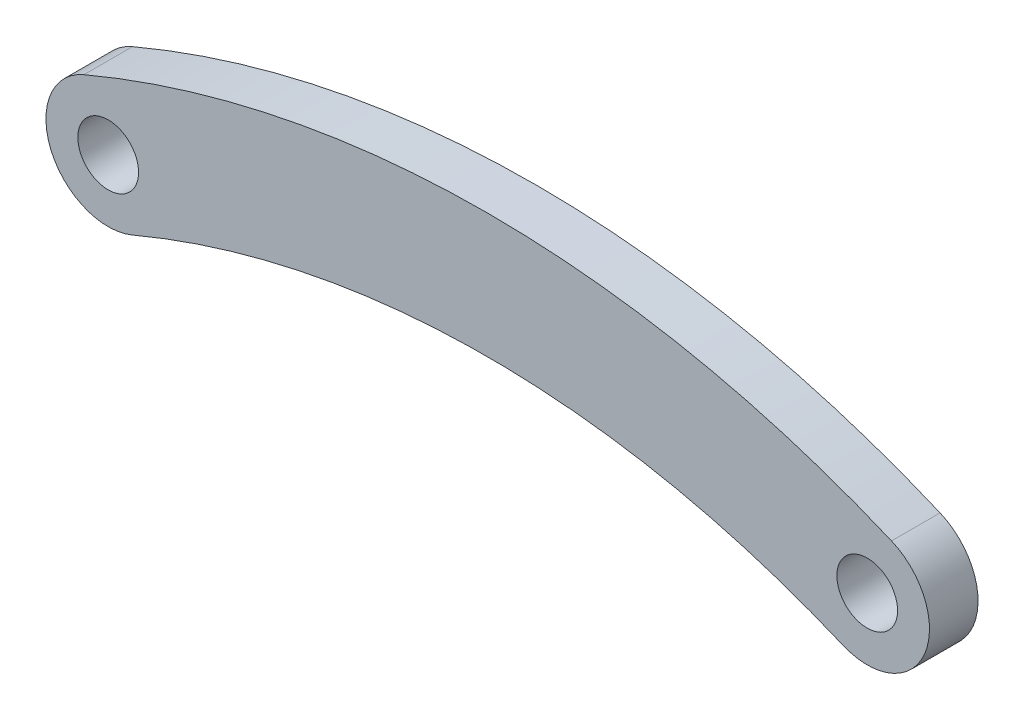
ISO-10303-21;
HEADER;
FILE_DESCRIPTION(('STEP AP214'),'2;1');
FILE_NAME('part.step','',(''),(''),'','','');
FILE_SCHEMA(('AUTOMOTIVE_DESIGN { 1 0 10303 214 1 1 1 1 }'));
ENDSEC;
DATA;
#1=APPLICATION_CONTEXT('core data for automotive mechanical design processes');
#2=APPLICATION_PROTOCOL_DEFINITION('international standard','automotive_design',2000,#1);
#3=PRODUCT_CONTEXT('',#1,'mechanical');
#4=PRODUCT('Part','Part','',(#3));
#5=PRODUCT_RELATED_PRODUCT_CATEGORY('part','',(#4));
#6=PRODUCT_DEFINITION_FORMATION('','',#4);
#7=PRODUCT_DEFINITION_CONTEXT('part definition',#1,'design');
#8=PRODUCT_DEFINITION('design','',#6,#7);
#9=PRODUCT_DEFINITION_SHAPE('','',#8);
#10=(LENGTH_UNIT() NAMED_UNIT(*) SI_UNIT(.MILLI.,.METRE.));
#11=(NAMED_UNIT(*) PLANE_ANGLE_UNIT() SI_UNIT($,.RADIAN.));
#12=(NAMED_UNIT(*) SI_UNIT($,.STERADIAN.) SOLID_ANGLE_UNIT());
#13=UNCERTAINTY_MEASURE_WITH_UNIT(LENGTH_MEASURE(1.E-05),#10,'distance_accuracy_value','');
#14=(GEOMETRIC_REPRESENTATION_CONTEXT(3) GLOBAL_UNCERTAINTY_ASSIGNED_CONTEXT((#13)) GLOBAL_UNIT_ASSIGNED_CONTEXT((#10,
#11,#12)) REPRESENTATION_CONTEXT('',''));
#15=CARTESIAN_POINT('',(0.,0.,0.));
#16=DIRECTION('',(0.,0.,1.));
#17=DIRECTION('',(1.,0.,0.));
#18=AXIS2_PLACEMENT_3D('',#15,#16,#17);
#19=CARTESIAN_POINT('',(18.75,-14.7559521888626,1.6));
#20=DIRECTION('',(0.,0.,1.));
#21=DIRECTION('',(1.,0.,0.));
#22=AXIS2_PLACEMENT_3D('',#19,#20,#21);
#23=PLANE('',#22);
#24=CARTESIAN_POINT('',(0.,0.,1.6));
#25=DIRECTION('',(0.,0.,1.));
#26=DIRECTION('',(1.,0.,0.));
#27=AXIS2_PLACEMENT_3D('',#24,#25,#26);
#28=CIRCLE('',#27,1.);
#29=CARTESIAN_POINT('',(1.,0.,1.6));
#30=VERTEX_POINT('',#29);
#31=EDGE_CURVE('E99',#30,#30,#28,.T.);
#32=ORIENTED_EDGE('',*,*,#31,.F.);
#33=EDGE_LOOP('',(#32));
#34=FACE_BOUND('',#33,.T.);
#35=CARTESIAN_POINT('',(25.,0.,1.6));
#36=DIRECTION('',(0.,0.,1.));
#37=DIRECTION('',(1.,0.,0.));
#38=AXIS2_PLACEMENT_3D('',#35,#36,#37);
#39=CIRCLE('',#38,2.04999999999999);
#40=CARTESIAN_POINT('',(24.2004680187207,-1.88765691027571,1.6));
#41=VERTEX_POINT('',#40);
#42=CARTESIAN_POINT('',(25.7995319812792,1.88765691027572,1.6));
#43=VERTEX_POINT('',#42);
#44=EDGE_CURVE('E84',#41,#43,#39,.T.);
#45=ORIENTED_EDGE('',*,*,#44,.T.);
#46=CARTESIAN_POINT('',(12.5,-29.5119043777253,1.6));
#47=DIRECTION('',(0.,0.,1.));
#48=DIRECTION('',(1.,0.,0.));
#49=AXIS2_PLACEMENT_3D('',#46,#47,#48);
#50=CIRCLE('',#49,34.1);
#51=CARTESIAN_POINT('',(-0.799531981279251,1.88765691027571,1.6));
#52=VERTEX_POINT('',#51);
#53=EDGE_CURVE('E79',#43,#52,#50,.T.);
#54=ORIENTED_EDGE('',*,*,#53,.T.);
#55=CARTESIAN_POINT('',(0.,0.,1.6));
#56=DIRECTION('',(0.,0.,1.));
#57=DIRECTION('',(1.,0.,0.));
#58=AXIS2_PLACEMENT_3D('',#55,#56,#57);
#59=CIRCLE('',#58,2.04999999999999);
#60=CARTESIAN_POINT('',(0.799531981279247,-1.88765691027571,1.6));
#61=VERTEX_POINT('',#60);
#62=EDGE_CURVE('E82',#52,#61,#59,.T.);
#63=ORIENTED_EDGE('',*,*,#62,.T.);
#64=CARTESIAN_POINT('',(12.5,-29.5119043777253,1.6));
#65=DIRECTION('',(0.,0.,-1.));
#66=DIRECTION('',(1.,0.,0.));
#67=AXIS2_PLACEMENT_3D('',#64,#65,#66);
#68=CIRCLE('',#67,30.);
#69=EDGE_CURVE('E49',#61,#41,#68,.T.);
#70=ORIENTED_EDGE('',*,*,#69,.T.);
#71=EDGE_LOOP('',(#45,#54,#63,#70));
#72=FACE_BOUND('',#71,.T.);
#73=CARTESIAN_POINT('',(25.,0.,1.6));
#74=DIRECTION('',(0.,0.,1.));
#75=DIRECTION('',(1.,0.,0.));
#76=AXIS2_PLACEMENT_3D('',#73,#74,#75);
#77=CIRCLE('',#76,1.);
#78=CARTESIAN_POINT('',(26.,0.,1.6));
#79=VERTEX_POINT('',#78);
#80=EDGE_CURVE('E114',#79,#79,#77,.T.);
#81=ORIENTED_EDGE('',*,*,#80,.F.);
#82=EDGE_LOOP('',(#81));
#83=FACE_BOUND('',#82,.T.);
#84=ADVANCED_FACE('F32',(#34,#72,#83),#23,.T.);
#85=CARTESIAN_POINT('',(18.75,-14.7559521888626,0.));
#86=DIRECTION('',(0.,0.,1.));
#87=DIRECTION('',(1.,0.,0.));
#88=AXIS2_PLACEMENT_3D('',#85,#86,#87);
#89=PLANE('',#88);
#90=CARTESIAN_POINT('',(25.,0.,0.));
#91=DIRECTION('',(0.,0.,1.));
#92=DIRECTION('',(1.,0.,0.));
#93=AXIS2_PLACEMENT_3D('',#90,#91,#92);
#94=CIRCLE('',#93,2.04999999999999);
#95=CARTESIAN_POINT('',(24.2004680187207,-1.88765691027571,0.));
#96=VERTEX_POINT('',#95);
#97=CARTESIAN_POINT('',(25.7995319812792,1.88765691027572,0.));
#98=VERTEX_POINT('',#97);
#99=EDGE_CURVE('E96',#96,#98,#94,.T.);
#100=ORIENTED_EDGE('',*,*,#99,.F.);
#101=CARTESIAN_POINT('',(12.5,-29.5119043777253,0.));
#102=DIRECTION('',(0.,0.,-1.));
#103=DIRECTION('',(1.,0.,0.));
#104=AXIS2_PLACEMENT_3D('',#101,#102,#103);
#105=CIRCLE('',#104,30.);
#106=CARTESIAN_POINT('',(0.799531981279247,-1.88765691027571,0.));
#107=VERTEX_POINT('',#106);
#108=EDGE_CURVE('E72',#107,#96,#105,.T.);
#109=ORIENTED_EDGE('',*,*,#108,.F.);
#110=CARTESIAN_POINT('',(0.,0.,0.));
#111=DIRECTION('',(0.,0.,1.));
#112=DIRECTION('',(1.,0.,0.));
#113=AXIS2_PLACEMENT_3D('',#110,#111,#112);
#114=CIRCLE('',#113,2.04999999999999);
#115=CARTESIAN_POINT('',(-0.799531981279251,1.88765691027571,0.));
#116=VERTEX_POINT('',#115);
#117=EDGE_CURVE('E66',#116,#107,#114,.T.);
#118=ORIENTED_EDGE('',*,*,#117,.F.);
#119=CARTESIAN_POINT('',(12.5,-29.5119043777253,0.));
#120=DIRECTION('',(0.,0.,1.));
#121=DIRECTION('',(1.,0.,0.));
#122=AXIS2_PLACEMENT_3D('',#119,#120,#121);
#123=CIRCLE('',#122,34.1);
#124=EDGE_CURVE('E88',#98,#116,#123,.T.);
#125=ORIENTED_EDGE('',*,*,#124,.F.);
#126=EDGE_LOOP('',(#100,#109,#118,#125));
#127=FACE_BOUND('',#126,.T.);
#128=CARTESIAN_POINT('',(0.,0.,0.));
#129=DIRECTION('',(0.,0.,1.));
#130=DIRECTION('',(1.,0.,0.));
#131=AXIS2_PLACEMENT_3D('',#128,#129,#130);
#132=CIRCLE('',#131,1.);
#133=CARTESIAN_POINT('',(1.,0.,0.));
#134=VERTEX_POINT('',#133);
#135=EDGE_CURVE('E111',#134,#134,#132,.T.);
#136=ORIENTED_EDGE('',*,*,#135,.T.);
#137=EDGE_LOOP('',(#136));
#138=FACE_BOUND('',#137,.T.);
#139=CARTESIAN_POINT('',(25.,0.,0.));
#140=DIRECTION('',(0.,0.,1.));
#141=DIRECTION('',(1.,0.,0.));
#142=AXIS2_PLACEMENT_3D('',#139,#140,#141);
#143=CIRCLE('',#142,1.);
#144=CARTESIAN_POINT('',(26.,0.,0.));
#145=VERTEX_POINT('',#144);
#146=EDGE_CURVE('E117',#145,#145,#143,.T.);
#147=ORIENTED_EDGE('',*,*,#146,.T.);
#148=EDGE_LOOP('',(#147));
#149=FACE_BOUND('',#148,.T.);
#150=ADVANCED_FACE('F107',(#127,#138,#149),#89,.F.);
#151=CARTESIAN_POINT('',(25.,0.,1.6));
#152=DIRECTION('',(0.,0.,-1.));
#153=DIRECTION('',(-1.,0.,0.));
#154=AXIS2_PLACEMENT_3D('',#151,#152,#153);
#155=CYLINDRICAL_SURFACE('',#154,2.04999999999999);
#156=ORIENTED_EDGE('',*,*,#99,.T.);
#157=DIRECTION('',(0.,0.,-1.));
#158=VECTOR('',#157,1.);
#159=CARTESIAN_POINT('',(25.7995319812792,1.88765691027572,1.6));
#160=LINE('',#159,#158);
#161=EDGE_CURVE('E11',#43,#98,#160,.T.);
#162=ORIENTED_EDGE('',*,*,#161,.F.);
#163=ORIENTED_EDGE('',*,*,#44,.F.);
#164=DIRECTION('',(0.,0.,-1.));
#165=VECTOR('',#164,1.);
#166=CARTESIAN_POINT('',(24.2004680187207,-1.88765691027571,1.6));
#167=LINE('',#166,#165);
#168=EDGE_CURVE('E92',#41,#96,#167,.T.);
#169=ORIENTED_EDGE('',*,*,#168,.T.);
#170=EDGE_LOOP('',(#156,#162,#163,#169));
#171=FACE_BOUND('',#170,.T.);
#172=ADVANCED_FACE('F34',(#171),#155,.T.);
#173=CARTESIAN_POINT('',(12.5,-29.5119043777253,1.6));
#174=DIRECTION('',(0.,0.,-1.));
#175=DIRECTION('',(-1.,0.,0.));
#176=AXIS2_PLACEMENT_3D('',#173,#174,#175);
#177=CYLINDRICAL_SURFACE('',#176,34.1);
#178=ORIENTED_EDGE('',*,*,#124,.T.);
#179=DIRECTION('',(0.,0.,-1.));
#180=VECTOR('',#179,1.);
#181=CARTESIAN_POINT('',(-0.799531981279251,1.88765691027571,1.6));
#182=LINE('',#181,#180);
#183=EDGE_CURVE('E41',#52,#116,#182,.T.);
#184=ORIENTED_EDGE('',*,*,#183,.F.);
#185=ORIENTED_EDGE('',*,*,#53,.F.);
#186=ORIENTED_EDGE('',*,*,#161,.T.);
#187=EDGE_LOOP('',(#178,#184,#185,#186));
#188=FACE_BOUND('',#187,.T.);
#189=ADVANCED_FACE('F87',(#188),#177,.T.);
#190=CARTESIAN_POINT('',(0.,0.,1.6));
#191=DIRECTION('',(0.,0.,-1.));
#192=DIRECTION('',(-1.,0.,0.));
#193=AXIS2_PLACEMENT_3D('',#190,#191,#192);
#194=CYLINDRICAL_SURFACE('',#193,2.04999999999999);
#195=ORIENTED_EDGE('',*,*,#117,.T.);
#196=DIRECTION('',(0.,0.,-1.));
#197=VECTOR('',#196,1.);
#198=CARTESIAN_POINT('',(0.799531981279247,-1.88765691027571,1.6));
#199=LINE('',#198,#197);
#200=EDGE_CURVE('E89',#61,#107,#199,.T.);
#201=ORIENTED_EDGE('',*,*,#200,.F.);
#202=ORIENTED_EDGE('',*,*,#62,.F.);
#203=ORIENTED_EDGE('',*,*,#183,.T.);
#204=EDGE_LOOP('',(#195,#201,#202,#203));
#205=FACE_BOUND('',#204,.T.);
#206=ADVANCED_FACE('F90',(#205),#194,.T.);
#207=CARTESIAN_POINT('',(12.5,-29.5119043777253,1.6));
#208=DIRECTION('',(0.,0.,-1.));
#209=DIRECTION('',(-1.,0.,0.));
#210=AXIS2_PLACEMENT_3D('',#207,#208,#209);
#211=CYLINDRICAL_SURFACE('',#210,30.);
#212=ORIENTED_EDGE('',*,*,#108,.T.);
#213=ORIENTED_EDGE('',*,*,#168,.F.);
#214=ORIENTED_EDGE('',*,*,#69,.F.);
#215=ORIENTED_EDGE('',*,*,#200,.T.);
#216=EDGE_LOOP('',(#212,#213,#214,#215));
#217=FACE_BOUND('',#216,.T.);
#218=ADVANCED_FACE('F104',(#217),#211,.F.);
#219=CARTESIAN_POINT('',(0.,0.,1.6));
#220=DIRECTION('',(0.,0.,-1.));
#221=DIRECTION('',(-1.,0.,0.));
#222=AXIS2_PLACEMENT_3D('',#219,#220,#221);
#223=CYLINDRICAL_SURFACE('',#222,1.);
#224=ORIENTED_EDGE('',*,*,#31,.T.);
#225=EDGE_LOOP('',(#224));
#226=FACE_BOUND('',#225,.T.);
#227=ORIENTED_EDGE('',*,*,#135,.F.);
#228=EDGE_LOOP('',(#227));
#229=FACE_BOUND('',#228,.T.);
#230=ADVANCED_FACE('F134',(#226,#229),#223,.F.);
#231=CARTESIAN_POINT('',(25.,0.,1.6));
#232=DIRECTION('',(0.,0.,-1.));
#233=DIRECTION('',(-1.,0.,0.));
#234=AXIS2_PLACEMENT_3D('',#231,#232,#233);
#235=CYLINDRICAL_SURFACE('',#234,1.);
#236=ORIENTED_EDGE('',*,*,#80,.T.);
#237=EDGE_LOOP('',(#236));
#238=FACE_BOUND('',#237,.T.);
#239=ORIENTED_EDGE('',*,*,#146,.F.);
#240=EDGE_LOOP('',(#239));
#241=FACE_BOUND('',#240,.T.);
#242=ADVANCED_FACE('F123',(#238,#241),#235,.F.);
#243=CLOSED_SHELL('',(#84,#150,#172,#189,#206,#218,#230,#242));
#244=MANIFOLD_SOLID_BREP('B2',#243);
#245=ADVANCED_BREP_SHAPE_REPRESENTATION('',(#18,#244),#14);
#246=SHAPE_DEFINITION_REPRESENTATION(#9,#245);
ENDSEC;
END-ISO-10303-21;
